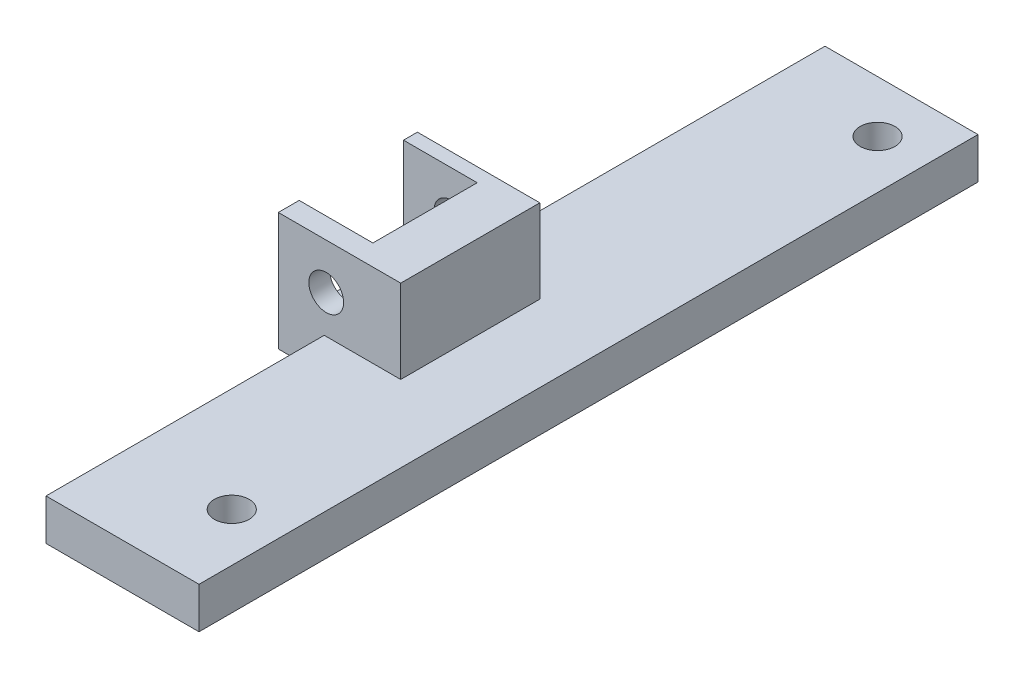
ISO-10303-21;
HEADER;
FILE_DESCRIPTION(('STEP AP214'),'2;1');
FILE_NAME('part.step','',(''),(''),'','','');
FILE_SCHEMA(('AUTOMOTIVE_DESIGN { 1 0 10303 214 1 1 1 1 }'));
ENDSEC;
DATA;
#1=APPLICATION_CONTEXT('core data for automotive mechanical design processes');
#2=APPLICATION_PROTOCOL_DEFINITION('international standard','automotive_design',2000,#1);
#3=PRODUCT_CONTEXT('',#1,'mechanical');
#4=PRODUCT('Part','Part','',(#3));
#5=PRODUCT_RELATED_PRODUCT_CATEGORY('part','',(#4));
#6=PRODUCT_DEFINITION_FORMATION('','',#4);
#7=PRODUCT_DEFINITION_CONTEXT('part definition',#1,'design');
#8=PRODUCT_DEFINITION('design','',#6,#7);
#9=PRODUCT_DEFINITION_SHAPE('','',#8);
#10=(LENGTH_UNIT() NAMED_UNIT(*) SI_UNIT(.MILLI.,.METRE.));
#11=(NAMED_UNIT(*) PLANE_ANGLE_UNIT() SI_UNIT($,.RADIAN.));
#12=(NAMED_UNIT(*) SI_UNIT($,.STERADIAN.) SOLID_ANGLE_UNIT());
#13=UNCERTAINTY_MEASURE_WITH_UNIT(LENGTH_MEASURE(1.E-05),#10,'distance_accuracy_value','');
#14=(GEOMETRIC_REPRESENTATION_CONTEXT(3) GLOBAL_UNCERTAINTY_ASSIGNED_CONTEXT((#13)) GLOBAL_UNIT_ASSIGNED_CONTEXT((#10,
#11,#12)) REPRESENTATION_CONTEXT('',''));
#15=CARTESIAN_POINT('',(0.,0.,0.));
#16=DIRECTION('',(0.,0.,1.));
#17=DIRECTION('',(1.,0.,0.));
#18=AXIS2_PLACEMENT_3D('',#15,#16,#17);
#19=CARTESIAN_POINT('',(801.338321143161,105.685777143036,-21.59));
#20=DIRECTION('',(0.,0.,1.));
#21=DIRECTION('',(1.,0.,0.));
#22=AXIS2_PLACEMENT_3D('',#19,#20,#21);
#23=CYLINDRICAL_SURFACE('',#22,9.525);
#24=DIRECTION('',(0.,0.,1.));
#25=VECTOR('',#24,1.);
#26=CARTESIAN_POINT('',(807.841366033056,98.7261771430357,-21.59));
#27=LINE('',#26,#25);
#28=CARTESIAN_POINT('',(807.841366033056,98.7261771430357,0.));
#29=VERTEX_POINT('',#28);
#30=CARTESIAN_POINT('',(807.841366033056,98.7261771430357,-19.05));
#31=VERTEX_POINT('',#30);
#32=EDGE_CURVE('E227',#29,#31,#27,.F.);
#33=ORIENTED_EDGE('',*,*,#32,.F.);
#34=CARTESIAN_POINT('',(801.338321143161,105.685777143036,0.));
#35=DIRECTION('',(0.,0.,1.));
#36=DIRECTION('',(1.,0.,0.));
#37=AXIS2_PLACEMENT_3D('',#34,#35,#36);
#38=CIRCLE('',#37,9.525);
#39=CARTESIAN_POINT('',(806.045825879218,113.966177143036,0.));
#40=VERTEX_POINT('',#39);
#41=EDGE_CURVE('E322',#29,#40,#38,.T.);
#42=ORIENTED_EDGE('',*,*,#41,.T.);
#43=DIRECTION('',(0.,0.,1.));
#44=VECTOR('',#43,1.);
#45=CARTESIAN_POINT('',(806.045825879218,113.966177143036,-21.59));
#46=LINE('',#45,#44);
#47=CARTESIAN_POINT('',(806.045825879218,113.966177143036,-19.05));
#48=VERTEX_POINT('',#47);
#49=EDGE_CURVE('E343',#48,#40,#46,.T.);
#50=ORIENTED_EDGE('',*,*,#49,.F.);
#51=CARTESIAN_POINT('',(801.338321143161,105.685777143036,-19.05));
#52=DIRECTION('',(0.,0.,1.));
#53=DIRECTION('',(1.,0.,0.));
#54=AXIS2_PLACEMENT_3D('',#51,#52,#53);
#55=CIRCLE('',#54,9.525);
#56=EDGE_CURVE('E266',#31,#48,#55,.T.);
#57=ORIENTED_EDGE('',*,*,#56,.F.);
#58=EDGE_LOOP('',(#33,#42,#50,#57));
#59=FACE_BOUND('',#58,.T.);
#60=ADVANCED_FACE('F47',(#59),#23,.F.);
#61=CARTESIAN_POINT('',(814.935825879218,0.,-21.59));
#62=DIRECTION('',(1.,0.,0.));
#63=DIRECTION('',(0.,0.,-1.));
#64=AXIS2_PLACEMENT_3D('',#61,#62,#63);
#65=PLANE('',#64);
#66=DIRECTION('',(0.,1.,0.));
#67=VECTOR('',#66,1.);
#68=CARTESIAN_POINT('',(814.935825879218,92.3761771430357,3.80999999999999));
#69=LINE('',#68,#67);
#70=CARTESIAN_POINT('',(814.935825879218,98.7261771430357,3.80999999999999));
#71=VERTEX_POINT('',#70);
#72=CARTESIAN_POINT('',(814.935825879218,113.966177143036,3.80999999999999));
#73=VERTEX_POINT('',#72);
#74=EDGE_CURVE('E307',#71,#73,#69,.T.);
#75=ORIENTED_EDGE('',*,*,#74,.F.);
#76=DIRECTION('',(0.,0.,-1.));
#77=VECTOR('',#76,1.);
#78=CARTESIAN_POINT('',(814.935825879218,98.7261771430357,-21.59));
#79=LINE('',#78,#77);
#80=CARTESIAN_POINT('',(814.935825879218,98.7261771430357,-21.59));
#81=VERTEX_POINT('',#80);
#82=EDGE_CURVE('E242',#71,#81,#79,.T.);
#83=ORIENTED_EDGE('',*,*,#82,.T.);
#84=DIRECTION('',(0.,1.,0.));
#85=VECTOR('',#84,1.);
#86=CARTESIAN_POINT('',(814.935825879218,0.,-21.59));
#87=LINE('',#86,#85);
#88=CARTESIAN_POINT('',(814.935825879218,113.966177143036,-21.59));
#89=VERTEX_POINT('',#88);
#90=EDGE_CURVE('E331',#81,#89,#87,.T.);
#91=ORIENTED_EDGE('',*,*,#90,.T.);
#92=DIRECTION('',(0.,0.,1.));
#93=VECTOR('',#92,1.);
#94=CARTESIAN_POINT('',(814.935825879218,113.966177143036,-21.59));
#95=LINE('',#94,#93);
#96=EDGE_CURVE('E347',#89,#73,#95,.T.);
#97=ORIENTED_EDGE('',*,*,#96,.T.);
#98=EDGE_LOOP('',(#75,#83,#91,#97));
#99=FACE_BOUND('',#98,.T.);
#100=ADVANCED_FACE('F394',(#99),#65,.T.);
#101=CARTESIAN_POINT('',(0.,113.966177143036,-21.59));
#102=DIRECTION('',(0.,1.,0.));
#103=DIRECTION('',(0.,0.,1.));
#104=AXIS2_PLACEMENT_3D('',#101,#102,#103);
#105=PLANE('',#104);
#106=DIRECTION('',(-1.,0.,0.));
#107=VECTOR('',#106,1.);
#108=CARTESIAN_POINT('',(0.,113.966177143036,-21.59));
#109=LINE('',#108,#107);
#110=CARTESIAN_POINT('',(792.583825879217,113.966177143036,-21.59));
#111=VERTEX_POINT('',#110);
#112=EDGE_CURVE('E334',#89,#111,#109,.T.);
#113=ORIENTED_EDGE('',*,*,#112,.T.);
#114=DIRECTION('',(0.,0.,-1.));
#115=VECTOR('',#114,1.);
#116=CARTESIAN_POINT('',(792.583825879217,113.966177143036,6.46807626496391));
#117=LINE('',#116,#115);
#118=CARTESIAN_POINT('',(792.583825879217,113.966177143036,-19.05));
#119=VERTEX_POINT('',#118);
#120=EDGE_CURVE('E283',#119,#111,#117,.T.);
#121=ORIENTED_EDGE('',*,*,#120,.F.);
#122=DIRECTION('',(-1.,0.,0.));
#123=VECTOR('',#122,1.);
#124=CARTESIAN_POINT('',(0.,113.966177143036,-19.05));
#125=LINE('',#124,#123);
#126=EDGE_CURVE('E263',#48,#119,#125,.T.);
#127=ORIENTED_EDGE('',*,*,#126,.F.);
#128=ORIENTED_EDGE('',*,*,#49,.T.);
#129=DIRECTION('',(-1.,0.,0.));
#130=VECTOR('',#129,1.);
#131=CARTESIAN_POINT('',(792.583825879217,113.966177143036,0.));
#132=LINE('',#131,#130);
#133=CARTESIAN_POINT('',(792.583825879217,113.966177143036,0.));
#134=VERTEX_POINT('',#133);
#135=EDGE_CURVE('E303',#40,#134,#132,.T.);
#136=ORIENTED_EDGE('',*,*,#135,.T.);
#137=DIRECTION('',(0.,0.,-1.));
#138=VECTOR('',#137,1.);
#139=CARTESIAN_POINT('',(792.583825879217,113.966177143036,3.80999999999999));
#140=LINE('',#139,#138);
#141=CARTESIAN_POINT('',(792.583825879217,113.966177143036,3.80999999999999));
#142=VERTEX_POINT('',#141);
#143=EDGE_CURVE('E313',#142,#134,#140,.T.);
#144=ORIENTED_EDGE('',*,*,#143,.F.);
#145=DIRECTION('',(-1.,0.,0.));
#146=VECTOR('',#145,1.);
#147=CARTESIAN_POINT('',(792.583825879217,113.966177143036,3.80999999999999));
#148=LINE('',#147,#146);
#149=EDGE_CURVE('E310',#73,#142,#148,.T.);
#150=ORIENTED_EDGE('',*,*,#149,.F.);
#151=ORIENTED_EDGE('',*,*,#96,.F.);
#152=EDGE_LOOP('',(#113,#121,#127,#128,#136,#144,#150,#151));
#153=FACE_BOUND('',#152,.T.);
#154=ADVANCED_FACE('F372',(#153),#105,.T.);
#155=CARTESIAN_POINT('',(0.,92.3761771430357,-21.59));
#156=DIRECTION('',(0.,-1.,0.));
#157=DIRECTION('',(0.,0.,-1.));
#158=AXIS2_PLACEMENT_3D('',#155,#156,#157);
#159=PLANE('',#158);
#160=DIRECTION('',(0.,0.,-1.));
#161=VECTOR('',#160,1.);
#162=CARTESIAN_POINT('',(800.965825879218,92.3761771430357,-21.59));
#163=LINE('',#162,#161);
#164=CARTESIAN_POINT('',(800.965825879218,92.3761771430357,3.80999999999999));
#165=VERTEX_POINT('',#164);
#166=CARTESIAN_POINT('',(800.965825879218,92.3761771430357,-21.59));
#167=VERTEX_POINT('',#166);
#168=EDGE_CURVE('E257',#165,#167,#163,.T.);
#169=ORIENTED_EDGE('',*,*,#168,.F.);
#170=DIRECTION('',(1.,0.,0.));
#171=VECTOR('',#170,1.);
#172=CARTESIAN_POINT('',(792.583825879217,92.3761771430357,3.80999999999999));
#173=LINE('',#172,#171);
#174=CARTESIAN_POINT('',(792.583825879217,92.3761771430357,3.80999999999999));
#175=VERTEX_POINT('',#174);
#176=EDGE_CURVE('E302',#175,#165,#173,.T.);
#177=ORIENTED_EDGE('',*,*,#176,.F.);
#178=DIRECTION('',(0.,0.,1.));
#179=VECTOR('',#178,1.);
#180=CARTESIAN_POINT('',(792.583825879217,92.3761771430357,-21.59));
#181=LINE('',#180,#179);
#182=CARTESIAN_POINT('',(792.583825879217,92.3761771430357,-21.59));
#183=VERTEX_POINT('',#182);
#184=EDGE_CURVE('E351',#183,#175,#181,.T.);
#185=ORIENTED_EDGE('',*,*,#184,.F.);
#186=DIRECTION('',(1.,0.,0.));
#187=VECTOR('',#186,1.);
#188=CARTESIAN_POINT('',(0.,92.3761771430357,-21.59));
#189=LINE('',#188,#187);
#190=EDGE_CURVE('E327',#183,#167,#189,.T.);
#191=ORIENTED_EDGE('',*,*,#190,.T.);
#192=EDGE_LOOP('',(#169,#177,#185,#191));
#193=FACE_BOUND('',#192,.T.);
#194=ADVANCED_FACE('F410',(#193),#159,.T.);
#195=CARTESIAN_POINT('',(792.583825879217,0.,-21.59));
#196=DIRECTION('',(-1.,0.,0.));
#197=DIRECTION('',(0.,0.,1.));
#198=AXIS2_PLACEMENT_3D('',#195,#196,#197);
#199=PLANE('',#198);
#200=ORIENTED_EDGE('',*,*,#184,.T.);
#201=DIRECTION('',(0.,-1.,0.));
#202=VECTOR('',#201,1.);
#203=CARTESIAN_POINT('',(792.583825879217,92.3761771430357,3.80999999999999));
#204=LINE('',#203,#202);
#205=EDGE_CURVE('E298',#142,#175,#204,.T.);
#206=ORIENTED_EDGE('',*,*,#205,.F.);
#207=ORIENTED_EDGE('',*,*,#143,.T.);
#208=DIRECTION('',(0.,-1.,0.));
#209=VECTOR('',#208,1.);
#210=CARTESIAN_POINT('',(792.583825879217,92.3761771430357,0.));
#211=LINE('',#210,#209);
#212=CARTESIAN_POINT('',(792.583825879217,96.1607771430357,0.));
#213=VERTEX_POINT('',#212);
#214=EDGE_CURVE('E294',#134,#213,#211,.T.);
#215=ORIENTED_EDGE('',*,*,#214,.T.);
#216=DIRECTION('',(0.,0.,1.));
#217=VECTOR('',#216,1.);
#218=CARTESIAN_POINT('',(792.583825879217,96.1607771430357,-21.59));
#219=LINE('',#218,#217);
#220=CARTESIAN_POINT('',(792.583825879217,96.1607771430357,-19.05));
#221=VERTEX_POINT('',#220);
#222=EDGE_CURVE('E337',#221,#213,#219,.T.);
#223=ORIENTED_EDGE('',*,*,#222,.F.);
#224=DIRECTION('',(0.,1.,0.));
#225=VECTOR('',#224,1.);
#226=CARTESIAN_POINT('',(792.583825879217,0.,-19.05));
#227=LINE('',#226,#225);
#228=EDGE_CURVE('E279',#221,#119,#227,.T.);
#229=ORIENTED_EDGE('',*,*,#228,.T.);
#230=ORIENTED_EDGE('',*,*,#120,.T.);
#231=DIRECTION('',(0.,-1.,0.));
#232=VECTOR('',#231,1.);
#233=CARTESIAN_POINT('',(792.583825879217,0.,-21.59));
#234=LINE('',#233,#232);
#235=EDGE_CURVE('E323',#111,#183,#234,.T.);
#236=ORIENTED_EDGE('',*,*,#235,.T.);
#237=EDGE_LOOP('',(#200,#206,#207,#215,#223,#229,#230,#236));
#238=FACE_BOUND('',#237,.T.);
#239=ADVANCED_FACE('F383',(#238),#199,.T.);
#240=CARTESIAN_POINT('',(0.,96.1607771430357,-21.59));
#241=DIRECTION('',(0.,-1.,0.));
#242=DIRECTION('',(0.,0.,-1.));
#243=AXIS2_PLACEMENT_3D('',#240,#241,#242);
#244=PLANE('',#243);
#245=DIRECTION('',(1.,0.,0.));
#246=VECTOR('',#245,1.);
#247=CARTESIAN_POINT('',(0.,96.1607771430357,0.));
#248=LINE('',#247,#246);
#249=CARTESIAN_POINT('',(800.965825879218,96.1607771430357,0.));
#250=VERTEX_POINT('',#249);
#251=EDGE_CURVE('E328',#213,#250,#248,.T.);
#252=ORIENTED_EDGE('',*,*,#251,.T.);
#253=DIRECTION('',(0.,0.,-1.));
#254=VECTOR('',#253,1.);
#255=CARTESIAN_POINT('',(800.965825879218,96.1607771430357,-21.59));
#256=LINE('',#255,#254);
#257=CARTESIAN_POINT('',(800.965825879218,96.1607771430357,-19.05));
#258=VERTEX_POINT('',#257);
#259=EDGE_CURVE('E247',#250,#258,#256,.T.);
#260=ORIENTED_EDGE('',*,*,#259,.T.);
#261=DIRECTION('',(1.,0.,0.));
#262=VECTOR('',#261,1.);
#263=CARTESIAN_POINT('',(0.,96.1607771430357,-19.05));
#264=LINE('',#263,#262);
#265=EDGE_CURVE('E269',#221,#258,#264,.T.);
#266=ORIENTED_EDGE('',*,*,#265,.F.);
#267=ORIENTED_EDGE('',*,*,#222,.T.);
#268=EDGE_LOOP('',(#252,#260,#266,#267));
#269=FACE_BOUND('',#268,.T.);
#270=ADVANCED_FACE('F407',(#269),#244,.F.);
#271=CARTESIAN_POINT('',(0.,0.,-21.59));
#272=DIRECTION('',(0.,0.,1.));
#273=DIRECTION('',(1.,0.,0.));
#274=AXIS2_PLACEMENT_3D('',#271,#272,#273);
#275=PLANE('',#274);
#276=DIRECTION('',(1.,0.,0.));
#277=VECTOR('',#276,1.);
#278=CARTESIAN_POINT('',(0.,98.7261771430357,-21.59));
#279=LINE('',#278,#277);
#280=CARTESIAN_POINT('',(800.965825879218,98.7261771430357,-21.59));
#281=VERTEX_POINT('',#280);
#282=EDGE_CURVE('E62',#281,#81,#279,.T.);
#283=ORIENTED_EDGE('',*,*,#282,.F.);
#284=DIRECTION('',(0.,-1.,0.));
#285=VECTOR('',#284,1.);
#286=CARTESIAN_POINT('',(800.965825879218,0.,-21.59));
#287=LINE('',#286,#285);
#288=EDGE_CURVE('E66',#281,#167,#287,.T.);
#289=ORIENTED_EDGE('',*,*,#288,.T.);
#290=ORIENTED_EDGE('',*,*,#190,.F.);
#291=ORIENTED_EDGE('',*,*,#235,.F.);
#292=ORIENTED_EDGE('',*,*,#112,.F.);
#293=ORIENTED_EDGE('',*,*,#90,.F.);
#294=EDGE_LOOP('',(#283,#289,#290,#291,#292,#293));
#295=FACE_BOUND('',#294,.T.);
#296=CARTESIAN_POINT('',(801.338321143161,105.685777143036,-21.59));
#297=DIRECTION('',(0.,0.,-1.));
#298=DIRECTION('',(-1.,0.,0.));
#299=AXIS2_PLACEMENT_3D('',#296,#297,#298);
#300=CIRCLE('',#299,3.17500000000008);
#301=CARTESIAN_POINT('',(798.16332114316,105.685777143036,-21.59));
#302=VERTEX_POINT('',#301);
#303=EDGE_CURVE('E273',#302,#302,#300,.T.);
#304=ORIENTED_EDGE('',*,*,#303,.F.);
#305=EDGE_LOOP('',(#304));
#306=FACE_BOUND('',#305,.T.);
#307=ADVANCED_FACE('F395',(#295,#306),#275,.F.);
#308=CARTESIAN_POINT('',(0.,0.,0.));
#309=DIRECTION('',(0.,0.,-1.));
#310=DIRECTION('',(-1.,0.,0.));
#311=AXIS2_PLACEMENT_3D('',#308,#309,#310);
#312=PLANE('',#311);
#313=DIRECTION('',(0.,1.,0.));
#314=VECTOR('',#313,1.);
#315=CARTESIAN_POINT('',(800.965825879218,0.,0.));
#316=LINE('',#315,#314);
#317=CARTESIAN_POINT('',(800.965825879218,98.7261771430357,0.));
#318=VERTEX_POINT('',#317);
#319=EDGE_CURVE('E251',#250,#318,#316,.T.);
#320=ORIENTED_EDGE('',*,*,#319,.F.);
#321=ORIENTED_EDGE('',*,*,#251,.F.);
#322=ORIENTED_EDGE('',*,*,#214,.F.);
#323=ORIENTED_EDGE('',*,*,#135,.F.);
#324=ORIENTED_EDGE('',*,*,#41,.F.);
#325=DIRECTION('',(-1.,0.,0.));
#326=VECTOR('',#325,1.);
#327=CARTESIAN_POINT('',(0.,98.7261771430357,0.));
#328=LINE('',#327,#326);
#329=EDGE_CURVE('E234',#29,#318,#328,.T.);
#330=ORIENTED_EDGE('',*,*,#329,.T.);
#331=EDGE_LOOP('',(#320,#321,#322,#323,#324,#330));
#332=FACE_BOUND('',#331,.T.);
#333=CARTESIAN_POINT('',(801.338321143161,105.685777143036,0.));
#334=DIRECTION('',(0.,0.,1.));
#335=DIRECTION('',(1.,0.,0.));
#336=AXIS2_PLACEMENT_3D('',#333,#334,#335);
#337=CIRCLE('',#336,3.17500000000008);
#338=CARTESIAN_POINT('',(804.513321143161,105.685777143036,0.));
#339=VERTEX_POINT('',#338);
#340=EDGE_CURVE('E278',#339,#339,#337,.T.);
#341=ORIENTED_EDGE('',*,*,#340,.T.);
#342=EDGE_LOOP('',(#341));
#343=FACE_BOUND('',#342,.T.);
#344=ADVANCED_FACE('F378',(#332,#343),#312,.T.);
#345=CARTESIAN_POINT('',(0.,0.,3.80999999999999));
#346=DIRECTION('',(0.,0.,-1.));
#347=DIRECTION('',(-1.,0.,0.));
#348=AXIS2_PLACEMENT_3D('',#345,#346,#347);
#349=PLANE('',#348);
#350=ORIENTED_EDGE('',*,*,#176,.T.);
#351=DIRECTION('',(0.,1.,0.));
#352=VECTOR('',#351,1.);
#353=CARTESIAN_POINT('',(800.965825879218,0.,3.80999999999999));
#354=LINE('',#353,#352);
#355=CARTESIAN_POINT('',(800.965825879218,98.7261771430357,3.80999999999999));
#356=VERTEX_POINT('',#355);
#357=EDGE_CURVE('E254',#165,#356,#354,.T.);
#358=ORIENTED_EDGE('',*,*,#357,.T.);
#359=DIRECTION('',(-1.,0.,0.));
#360=VECTOR('',#359,1.);
#361=CARTESIAN_POINT('',(0.,98.7261771430357,3.80999999999999));
#362=LINE('',#361,#360);
#363=EDGE_CURVE('E238',#71,#356,#362,.T.);
#364=ORIENTED_EDGE('',*,*,#363,.F.);
#365=ORIENTED_EDGE('',*,*,#74,.T.);
#366=ORIENTED_EDGE('',*,*,#149,.T.);
#367=ORIENTED_EDGE('',*,*,#205,.T.);
#368=EDGE_LOOP('',(#350,#358,#364,#365,#366,#367));
#369=FACE_BOUND('',#368,.T.);
#370=CARTESIAN_POINT('',(801.338321143161,105.685777143036,3.80999999999999));
#371=DIRECTION('',(0.,0.,1.));
#372=DIRECTION('',(1.,0.,0.));
#373=AXIS2_PLACEMENT_3D('',#370,#371,#372);
#374=CIRCLE('',#373,3.17500000000008);
#375=CARTESIAN_POINT('',(804.513321143161,105.685777143036,3.80999999999999));
#376=VERTEX_POINT('',#375);
#377=EDGE_CURVE('E290',#376,#376,#374,.T.);
#378=ORIENTED_EDGE('',*,*,#377,.F.);
#379=EDGE_LOOP('',(#378));
#380=FACE_BOUND('',#379,.T.);
#381=ADVANCED_FACE('F389',(#369,#380),#349,.F.);
#382=CARTESIAN_POINT('',(801.338321143161,105.685777143036,3.80999999999999));
#383=DIRECTION('',(0.,0.,-1.));
#384=DIRECTION('',(-1.,0.,0.));
#385=AXIS2_PLACEMENT_3D('',#382,#383,#384);
#386=CYLINDRICAL_SURFACE('',#385,3.17500000000008);
#387=ORIENTED_EDGE('',*,*,#377,.T.);
#388=EDGE_LOOP('',(#387));
#389=FACE_BOUND('',#388,.T.);
#390=ORIENTED_EDGE('',*,*,#340,.F.);
#391=EDGE_LOOP('',(#390));
#392=FACE_BOUND('',#391,.T.);
#393=ADVANCED_FACE('F455',(#389,#392),#386,.F.);
#394=CARTESIAN_POINT('',(801.338321143161,105.685777143036,6.46807626496391));
#395=DIRECTION('',(0.,0.,-1.));
#396=DIRECTION('',(-1.,0.,0.));
#397=AXIS2_PLACEMENT_3D('',#394,#395,#396);
#398=CYLINDRICAL_SURFACE('',#397,3.17500000000008);
#399=ORIENTED_EDGE('',*,*,#303,.T.);
#400=EDGE_LOOP('',(#399));
#401=FACE_BOUND('',#400,.T.);
#402=CARTESIAN_POINT('',(801.338321143161,105.685777143036,-19.05));
#403=DIRECTION('',(0.,0.,1.));
#404=DIRECTION('',(1.,0.,0.));
#405=AXIS2_PLACEMENT_3D('',#402,#403,#404);
#406=CIRCLE('',#405,3.17500000000008);
#407=CARTESIAN_POINT('',(804.513321143161,105.685777143036,-19.05));
#408=VERTEX_POINT('',#407);
#409=EDGE_CURVE('E274',#408,#408,#406,.F.);
#410=ORIENTED_EDGE('',*,*,#409,.F.);
#411=EDGE_LOOP('',(#410));
#412=FACE_BOUND('',#411,.T.);
#413=ADVANCED_FACE('F458',(#401,#412),#398,.F.);
#414=CARTESIAN_POINT('',(801.338321143161,97.4053771430357,-19.05));
#415=DIRECTION('',(0.,0.,1.));
#416=DIRECTION('',(1.,0.,0.));
#417=AXIS2_PLACEMENT_3D('',#414,#415,#416);
#418=PLANE('',#417);
#419=DIRECTION('',(0.,-1.,0.));
#420=VECTOR('',#419,1.);
#421=CARTESIAN_POINT('',(800.965825879218,97.4053771430357,-19.05));
#422=LINE('',#421,#420);
#423=CARTESIAN_POINT('',(800.965825879218,98.7261771430357,-19.05));
#424=VERTEX_POINT('',#423);
#425=EDGE_CURVE('E11',#424,#258,#422,.T.);
#426=ORIENTED_EDGE('',*,*,#425,.F.);
#427=DIRECTION('',(1.,0.,0.));
#428=VECTOR('',#427,1.);
#429=CARTESIAN_POINT('',(801.338321143161,98.7261771430357,-19.05));
#430=LINE('',#429,#428);
#431=EDGE_CURVE('E55',#424,#31,#430,.T.);
#432=ORIENTED_EDGE('',*,*,#431,.T.);
#433=ORIENTED_EDGE('',*,*,#56,.T.);
#434=ORIENTED_EDGE('',*,*,#126,.T.);
#435=ORIENTED_EDGE('',*,*,#228,.F.);
#436=ORIENTED_EDGE('',*,*,#265,.T.);
#437=EDGE_LOOP('',(#426,#432,#433,#434,#435,#436));
#438=FACE_BOUND('',#437,.T.);
#439=ORIENTED_EDGE('',*,*,#409,.T.);
#440=EDGE_LOOP('',(#439));
#441=FACE_BOUND('',#440,.T.);
#442=ADVANCED_FACE('F360',(#438,#441),#418,.T.);
#443=CARTESIAN_POINT('',(0.,98.7261771430357,0.));
#444=DIRECTION('',(0.,-1.,0.));
#445=DIRECTION('',(0.,0.,-1.));
#446=AXIS2_PLACEMENT_3D('',#443,#444,#445);
#447=PLANE('',#446);
#448=ORIENTED_EDGE('',*,*,#329,.F.);
#449=ORIENTED_EDGE('',*,*,#32,.T.);
#450=ORIENTED_EDGE('',*,*,#431,.F.);
#451=DIRECTION('',(0.,0.,-1.));
#452=VECTOR('',#451,1.);
#453=CARTESIAN_POINT('',(800.965825879218,98.7261771430357,54.61));
#454=LINE('',#453,#452);
#455=EDGE_CURVE('E217',#318,#424,#454,.T.);
#456=ORIENTED_EDGE('',*,*,#455,.F.);
#457=EDGE_LOOP('',(#448,#449,#450,#456));
#458=FACE_BOUND('',#457,.T.);
#459=ADVANCED_FACE('F405',(#458),#447,.F.);
#460=CARTESIAN_POINT('',(800.965825879218,98.7261771430357,54.61));
#461=DIRECTION('',(-1.,0.,0.));
#462=DIRECTION('',(0.,0.,1.));
#463=AXIS2_PLACEMENT_3D('',#460,#461,#462);
#464=PLANE('',#463);
#465=ORIENTED_EDGE('',*,*,#259,.F.);
#466=ORIENTED_EDGE('',*,*,#319,.T.);
#467=ORIENTED_EDGE('',*,*,#455,.T.);
#468=ORIENTED_EDGE('',*,*,#425,.T.);
#469=EDGE_LOOP('',(#465,#466,#467,#468));
#470=FACE_BOUND('',#469,.T.);
#471=ADVANCED_FACE('F404',(#470),#464,.T.);
#472=ORIENTED_EDGE('',*,*,#288,.F.);
#473=CARTESIAN_POINT('',(800.965825879218,98.7261771430357,-87.63));
#474=VERTEX_POINT('',#473);
#475=EDGE_CURVE('E164',#281,#474,#454,.T.);
#476=ORIENTED_EDGE('',*,*,#475,.T.);
#477=DIRECTION('',(0.,-1.,0.));
#478=VECTOR('',#477,1.);
#479=CARTESIAN_POINT('',(800.965825879218,98.7261771430357,-87.63));
#480=LINE('',#479,#478);
#481=CARTESIAN_POINT('',(800.965825879218,91.2114000000001,-87.63));
#482=VERTEX_POINT('',#481);
#483=EDGE_CURVE('E159',#474,#482,#480,.T.);
#484=ORIENTED_EDGE('',*,*,#483,.T.);
#485=DIRECTION('',(0.,0.,1.));
#486=VECTOR('',#485,1.);
#487=CARTESIAN_POINT('',(800.965825879218,91.2114000000001,54.61));
#488=LINE('',#487,#486);
#489=CARTESIAN_POINT('',(800.965825879218,91.2114000000001,54.61));
#490=VERTEX_POINT('',#489);
#491=EDGE_CURVE('E162',#482,#490,#488,.T.);
#492=ORIENTED_EDGE('',*,*,#491,.T.);
#493=DIRECTION('',(0.,-1.,0.));
#494=VECTOR('',#493,1.);
#495=CARTESIAN_POINT('',(800.965825879218,98.7261771430357,54.61));
#496=LINE('',#495,#494);
#497=CARTESIAN_POINT('',(800.965825879218,98.7261771430357,54.61));
#498=VERTEX_POINT('',#497);
#499=EDGE_CURVE('E171',#498,#490,#496,.T.);
#500=ORIENTED_EDGE('',*,*,#499,.F.);
#501=EDGE_CURVE('E212',#498,#356,#454,.T.);
#502=ORIENTED_EDGE('',*,*,#501,.T.);
#503=ORIENTED_EDGE('',*,*,#357,.F.);
#504=ORIENTED_EDGE('',*,*,#168,.T.);
#505=EDGE_LOOP('',(#472,#476,#484,#492,#500,#502,#503,#504));
#506=FACE_BOUND('',#505,.T.);
#507=ADVANCED_FACE('F161',(#506),#464,.T.);
#508=CARTESIAN_POINT('',(820.039,98.7261771430357,-78.1600000000006));
#509=DIRECTION('',(0.,-1.,0.));
#510=DIRECTION('',(0.,0.,-1.));
#511=AXIS2_PLACEMENT_3D('',#508,#509,#510);
#512=CIRCLE('',#511,3.17500000000008);
#513=CARTESIAN_POINT('',(820.039,98.7261771430357,-81.3350000000007));
#514=VERTEX_POINT('',#513);
#515=EDGE_CURVE('E197',#514,#514,#512,.T.);
#516=ORIENTED_EDGE('',*,*,#515,.T.);
#517=EDGE_LOOP('',(#516));
#518=FACE_BOUND('',#517,.T.);
#519=CARTESIAN_POINT('',(820.039,98.7261771430357,39.7685714285709));
#520=DIRECTION('',(0.,-1.,0.));
#521=DIRECTION('',(0.,0.,-1.));
#522=AXIS2_PLACEMENT_3D('',#519,#520,#521);
#523=CIRCLE('',#522,3.17500000000008);
#524=CARTESIAN_POINT('',(820.039,98.7261771430357,36.5935714285708));
#525=VERTEX_POINT('',#524);
#526=EDGE_CURVE('E204',#525,#525,#523,.T.);
#527=ORIENTED_EDGE('',*,*,#526,.T.);
#528=EDGE_LOOP('',(#527));
#529=FACE_BOUND('',#528,.T.);
#530=ORIENTED_EDGE('',*,*,#475,.F.);
#531=ORIENTED_EDGE('',*,*,#282,.T.);
#532=ORIENTED_EDGE('',*,*,#82,.F.);
#533=ORIENTED_EDGE('',*,*,#363,.T.);
#534=ORIENTED_EDGE('',*,*,#501,.F.);
#535=DIRECTION('',(-1.,0.,0.));
#536=VECTOR('',#535,1.);
#537=CARTESIAN_POINT('',(828.905825879218,98.7261771430357,54.61));
#538=LINE('',#537,#536);
#539=CARTESIAN_POINT('',(828.905825879218,98.7261771430357,54.61));
#540=VERTEX_POINT('',#539);
#541=EDGE_CURVE('E208',#540,#498,#538,.T.);
#542=ORIENTED_EDGE('',*,*,#541,.F.);
#543=DIRECTION('',(0.,0.,1.));
#544=VECTOR('',#543,1.);
#545=CARTESIAN_POINT('',(828.905825879218,98.7261771430357,-87.63));
#546=LINE('',#545,#544);
#547=CARTESIAN_POINT('',(828.905825879218,98.7261771430357,-87.63));
#548=VERTEX_POINT('',#547);
#549=EDGE_CURVE('E220',#548,#540,#546,.T.);
#550=ORIENTED_EDGE('',*,*,#549,.F.);
#551=DIRECTION('',(1.,0.,0.));
#552=VECTOR('',#551,1.);
#553=CARTESIAN_POINT('',(800.965825879218,98.7261771430357,-87.63));
#554=LINE('',#553,#552);
#555=EDGE_CURVE('E216',#474,#548,#554,.T.);
#556=ORIENTED_EDGE('',*,*,#555,.F.);
#557=EDGE_LOOP('',(#530,#531,#532,#533,#534,#542,#550,#556));
#558=FACE_BOUND('',#557,.T.);
#559=ADVANCED_FACE('F399',(#518,#529,#558),#447,.F.);
#560=CARTESIAN_POINT('',(828.905825879218,98.7261771430357,54.61));
#561=DIRECTION('',(0.,0.,1.));
#562=DIRECTION('',(1.,0.,0.));
#563=AXIS2_PLACEMENT_3D('',#560,#561,#562);
#564=PLANE('',#563);
#565=ORIENTED_EDGE('',*,*,#499,.T.);
#566=DIRECTION('',(1.,0.,0.));
#567=VECTOR('',#566,1.);
#568=CARTESIAN_POINT('',(828.905825879218,91.2114000000001,54.61));
#569=LINE('',#568,#567);
#570=CARTESIAN_POINT('',(828.905825879218,91.2114000000001,54.61));
#571=VERTEX_POINT('',#570);
#572=EDGE_CURVE('E181',#490,#571,#569,.T.);
#573=ORIENTED_EDGE('',*,*,#572,.T.);
#574=DIRECTION('',(0.,-1.,0.));
#575=VECTOR('',#574,1.);
#576=CARTESIAN_POINT('',(828.905825879218,98.7261771430357,54.61));
#577=LINE('',#576,#575);
#578=EDGE_CURVE('E224',#540,#571,#577,.T.);
#579=ORIENTED_EDGE('',*,*,#578,.F.);
#580=ORIENTED_EDGE('',*,*,#541,.T.);
#581=EDGE_LOOP('',(#565,#573,#579,#580));
#582=FACE_BOUND('',#581,.T.);
#583=ADVANCED_FACE('F416',(#582),#564,.T.);
#584=CARTESIAN_POINT('',(828.905825879218,98.7261771430357,-87.63));
#585=DIRECTION('',(1.,0.,0.));
#586=DIRECTION('',(0.,0.,-1.));
#587=AXIS2_PLACEMENT_3D('',#584,#585,#586);
#588=PLANE('',#587);
#589=ORIENTED_EDGE('',*,*,#578,.T.);
#590=DIRECTION('',(0.,0.,-1.));
#591=VECTOR('',#590,1.);
#592=CARTESIAN_POINT('',(828.905825879218,91.2114000000001,-87.63));
#593=LINE('',#592,#591);
#594=CARTESIAN_POINT('',(828.905825879218,91.2114000000001,-87.63));
#595=VERTEX_POINT('',#594);
#596=EDGE_CURVE('E186',#571,#595,#593,.T.);
#597=ORIENTED_EDGE('',*,*,#596,.T.);
#598=DIRECTION('',(0.,-1.,0.));
#599=VECTOR('',#598,1.);
#600=CARTESIAN_POINT('',(828.905825879218,98.7261771430357,-87.63));
#601=LINE('',#600,#599);
#602=EDGE_CURVE('E170',#548,#595,#601,.T.);
#603=ORIENTED_EDGE('',*,*,#602,.F.);
#604=ORIENTED_EDGE('',*,*,#549,.T.);
#605=EDGE_LOOP('',(#589,#597,#603,#604));
#606=FACE_BOUND('',#605,.T.);
#607=ADVANCED_FACE('F418',(#606),#588,.T.);
#608=CARTESIAN_POINT('',(800.965825879218,98.7261771430357,-87.63));
#609=DIRECTION('',(0.,0.,-1.));
#610=DIRECTION('',(-1.,0.,0.));
#611=AXIS2_PLACEMENT_3D('',#608,#609,#610);
#612=PLANE('',#611);
#613=ORIENTED_EDGE('',*,*,#602,.T.);
#614=DIRECTION('',(-1.,0.,0.));
#615=VECTOR('',#614,1.);
#616=CARTESIAN_POINT('',(800.965825879218,91.2114000000001,-87.63));
#617=LINE('',#616,#615);
#618=EDGE_CURVE('E178',#595,#482,#617,.T.);
#619=ORIENTED_EDGE('',*,*,#618,.T.);
#620=ORIENTED_EDGE('',*,*,#483,.F.);
#621=ORIENTED_EDGE('',*,*,#555,.T.);
#622=EDGE_LOOP('',(#613,#619,#620,#621));
#623=FACE_BOUND('',#622,.T.);
#624=ADVANCED_FACE('F184',(#623),#612,.T.);
#625=CARTESIAN_POINT('',(820.039,98.7261771430357,39.7685714285709));
#626=DIRECTION('',(0.,-1.,0.));
#627=DIRECTION('',(0.,0.,-1.));
#628=AXIS2_PLACEMENT_3D('',#625,#626,#627);
#629=CYLINDRICAL_SURFACE('',#628,3.17500000000008);
#630=ORIENTED_EDGE('',*,*,#526,.F.);
#631=EDGE_LOOP('',(#630));
#632=FACE_BOUND('',#631,.T.);
#633=CARTESIAN_POINT('',(820.039,91.2114000000001,39.7685714285709));
#634=DIRECTION('',(0.,1.,0.));
#635=DIRECTION('',(0.,0.,1.));
#636=AXIS2_PLACEMENT_3D('',#633,#634,#635);
#637=CIRCLE('',#636,3.17500000000008);
#638=CARTESIAN_POINT('',(820.039,91.2114000000001,42.943571428571));
#639=VERTEX_POINT('',#638);
#640=EDGE_CURVE('E193',#639,#639,#637,.T.);
#641=ORIENTED_EDGE('',*,*,#640,.F.);
#642=EDGE_LOOP('',(#641));
#643=FACE_BOUND('',#642,.T.);
#644=ADVANCED_FACE('F425',(#632,#643),#629,.F.);
#645=CARTESIAN_POINT('',(820.039,98.7261771430357,-78.1600000000006));
#646=DIRECTION('',(0.,-1.,0.));
#647=DIRECTION('',(0.,0.,-1.));
#648=AXIS2_PLACEMENT_3D('',#645,#646,#647);
#649=CYLINDRICAL_SURFACE('',#648,3.17500000000008);
#650=ORIENTED_EDGE('',*,*,#515,.F.);
#651=EDGE_LOOP('',(#650));
#652=FACE_BOUND('',#651,.T.);
#653=CARTESIAN_POINT('',(820.039,91.2114000000001,-78.1600000000006));
#654=DIRECTION('',(0.,1.,0.));
#655=DIRECTION('',(0.,0.,1.));
#656=AXIS2_PLACEMENT_3D('',#653,#654,#655);
#657=CIRCLE('',#656,3.17500000000008);
#658=CARTESIAN_POINT('',(820.039,91.2114000000001,-74.9850000000005));
#659=VERTEX_POINT('',#658);
#660=EDGE_CURVE('E189',#659,#659,#657,.T.);
#661=ORIENTED_EDGE('',*,*,#660,.F.);
#662=EDGE_LOOP('',(#661));
#663=FACE_BOUND('',#662,.T.);
#664=ADVANCED_FACE('F482',(#652,#663),#649,.F.);
#665=CARTESIAN_POINT('',(820.039,91.2114000000002,39.7685714285709));
#666=DIRECTION('',(0.,1.,0.));
#667=DIRECTION('',(-1.,0.,0.));
#668=AXIS2_PLACEMENT_3D('',#665,#666,#667);
#669=PLANE('',#668);
#670=ORIENTED_EDGE('',*,*,#660,.T.);
#671=EDGE_LOOP('',(#670));
#672=FACE_BOUND('',#671,.T.);
#673=ORIENTED_EDGE('',*,*,#640,.T.);
#674=EDGE_LOOP('',(#673));
#675=FACE_BOUND('',#674,.T.);
#676=ORIENTED_EDGE('',*,*,#491,.F.);
#677=ORIENTED_EDGE('',*,*,#618,.F.);
#678=ORIENTED_EDGE('',*,*,#596,.F.);
#679=ORIENTED_EDGE('',*,*,#572,.F.);
#680=EDGE_LOOP('',(#676,#677,#678,#679));
#681=FACE_BOUND('',#680,.T.);
#682=ADVANCED_FACE('F176',(#672,#675,#681),#669,.F.);
#683=CLOSED_SHELL('',(#60,#100,#154,#194,#239,#270,#307,#344,#381,#393,#413,#442,#459,#471,#507,
#559,#583,#607,#624,#644,#664,#682));
#684=MANIFOLD_SOLID_BREP('B2',#683);
#685=ADVANCED_BREP_SHAPE_REPRESENTATION('',(#18,#684),#14);
#686=SHAPE_DEFINITION_REPRESENTATION(#9,#685);
ENDSEC;
END-ISO-10303-21;
